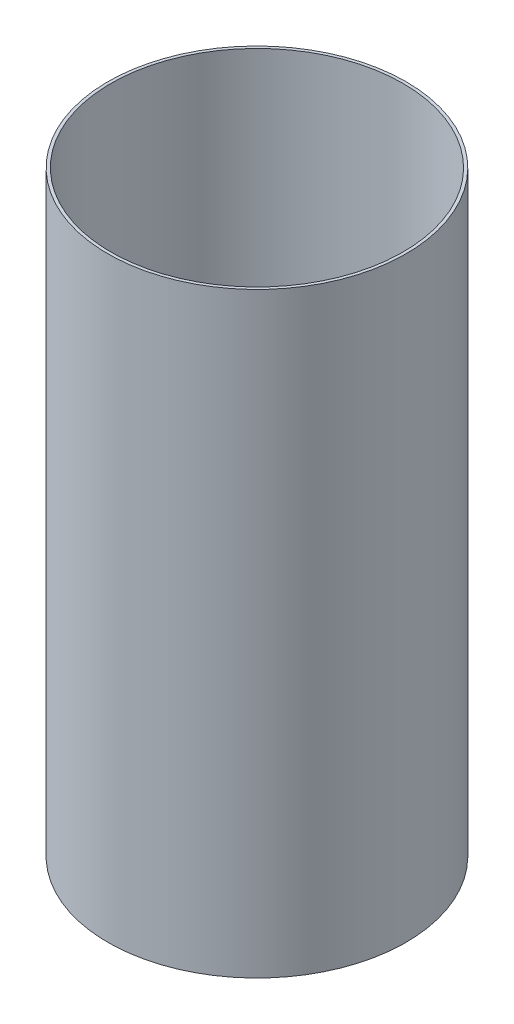
ISO-10303-21;
HEADER;
FILE_DESCRIPTION(('STEP AP214'),'2;1');
FILE_NAME('part.step','',(''),(''),'','','');
FILE_SCHEMA(('AUTOMOTIVE_DESIGN { 1 0 10303 214 1 1 1 1 }'));
ENDSEC;
DATA;
#1=APPLICATION_CONTEXT('core data for automotive mechanical design processes');
#2=APPLICATION_PROTOCOL_DEFINITION('international standard','automotive_design',2000,#1);
#3=PRODUCT_CONTEXT('',#1,'mechanical');
#4=PRODUCT('Part','Part','',(#3));
#5=PRODUCT_RELATED_PRODUCT_CATEGORY('part','',(#4));
#6=PRODUCT_DEFINITION_FORMATION('','',#4);
#7=PRODUCT_DEFINITION_CONTEXT('part definition',#1,'design');
#8=PRODUCT_DEFINITION('design','',#6,#7);
#9=PRODUCT_DEFINITION_SHAPE('','',#8);
#10=(LENGTH_UNIT() NAMED_UNIT(*) SI_UNIT(.MILLI.,.METRE.));
#11=(NAMED_UNIT(*) PLANE_ANGLE_UNIT() SI_UNIT($,.RADIAN.));
#12=(NAMED_UNIT(*) SI_UNIT($,.STERADIAN.) SOLID_ANGLE_UNIT());
#13=UNCERTAINTY_MEASURE_WITH_UNIT(LENGTH_MEASURE(1.E-05),#10,'distance_accuracy_value','');
#14=(GEOMETRIC_REPRESENTATION_CONTEXT(3) GLOBAL_UNCERTAINTY_ASSIGNED_CONTEXT((#13)) GLOBAL_UNIT_ASSIGNED_CONTEXT((#10,
#11,#12)) REPRESENTATION_CONTEXT('',''));
#15=CARTESIAN_POINT('',(0.,0.,0.));
#16=DIRECTION('',(0.,0.,1.));
#17=DIRECTION('',(1.,0.,0.));
#18=AXIS2_PLACEMENT_3D('',#15,#16,#17);
#19=CARTESIAN_POINT('',(0.,0.,0.));
#20=DIRECTION('',(0.,-1.,0.));
#21=DIRECTION('',(0.,0.,-1.));
#22=AXIS2_PLACEMENT_3D('',#19,#20,#21);
#23=CYLINDRICAL_SURFACE('',#22,50.);
#24=CARTESIAN_POINT('',(0.,200.,0.));
#25=DIRECTION('',(0.,-1.,0.));
#26=DIRECTION('',(0.,0.,-1.));
#27=AXIS2_PLACEMENT_3D('',#24,#25,#26);
#28=CIRCLE('',#27,50.);
#29=CARTESIAN_POINT('',(0.,200.,-50.));
#30=VERTEX_POINT('',#29);
#31=EDGE_CURVE('E45',#30,#30,#28,.T.);
#32=ORIENTED_EDGE('',*,*,#31,.T.);
#33=EDGE_LOOP('',(#32));
#34=FACE_BOUND('',#33,.T.);
#35=CARTESIAN_POINT('',(0.,0.,0.));
#36=DIRECTION('',(0.,-1.,0.));
#37=DIRECTION('',(0.,0.,-1.));
#38=AXIS2_PLACEMENT_3D('',#35,#36,#37);
#39=CIRCLE('',#38,50.);
#40=CARTESIAN_POINT('',(0.,0.,-50.));
#41=VERTEX_POINT('',#40);
#42=EDGE_CURVE('E10',#41,#41,#39,.T.);
#43=ORIENTED_EDGE('',*,*,#42,.F.);
#44=EDGE_LOOP('',(#43));
#45=FACE_BOUND('',#44,.T.);
#46=ADVANCED_FACE('F31',(#34,#45),#23,.T.);
#47=CARTESIAN_POINT('',(50.,0.,0.));
#48=DIRECTION('',(0.,1.,0.));
#49=DIRECTION('',(0.,0.,1.));
#50=AXIS2_PLACEMENT_3D('',#47,#48,#49);
#51=PLANE('',#50);
#52=CARTESIAN_POINT('',(0.,0.,0.));
#53=DIRECTION('',(0.,-1.,0.));
#54=DIRECTION('',(0.,0.,-1.));
#55=AXIS2_PLACEMENT_3D('',#52,#53,#54);
#56=CIRCLE('',#55,49.);
#57=CARTESIAN_POINT('',(0.,0.,-49.));
#58=VERTEX_POINT('',#57);
#59=EDGE_CURVE('E37',#58,#58,#56,.T.);
#60=ORIENTED_EDGE('',*,*,#59,.F.);
#61=EDGE_LOOP('',(#60));
#62=FACE_BOUND('',#61,.T.);
#63=ORIENTED_EDGE('',*,*,#42,.T.);
#64=EDGE_LOOP('',(#63));
#65=FACE_BOUND('',#64,.T.);
#66=ADVANCED_FACE('F61',(#62,#65),#51,.F.);
#67=CARTESIAN_POINT('',(0.,0.,0.));
#68=DIRECTION('',(0.,-1.,0.));
#69=DIRECTION('',(0.,0.,-1.));
#70=AXIS2_PLACEMENT_3D('',#67,#68,#69);
#71=CYLINDRICAL_SURFACE('',#70,49.);
#72=CARTESIAN_POINT('',(0.,200.,0.));
#73=DIRECTION('',(0.,-1.,0.));
#74=DIRECTION('',(0.,0.,-1.));
#75=AXIS2_PLACEMENT_3D('',#72,#73,#74);
#76=CIRCLE('',#75,49.);
#77=CARTESIAN_POINT('',(0.,200.,-49.));
#78=VERTEX_POINT('',#77);
#79=EDGE_CURVE('E41',#78,#78,#76,.T.);
#80=ORIENTED_EDGE('',*,*,#79,.F.);
#81=EDGE_LOOP('',(#80));
#82=FACE_BOUND('',#81,.T.);
#83=ORIENTED_EDGE('',*,*,#59,.T.);
#84=EDGE_LOOP('',(#83));
#85=FACE_BOUND('',#84,.T.);
#86=ADVANCED_FACE('F56',(#82,#85),#71,.F.);
#87=CARTESIAN_POINT('',(49.,200.,0.));
#88=DIRECTION('',(0.,-1.,0.));
#89=DIRECTION('',(0.,0.,-1.));
#90=AXIS2_PLACEMENT_3D('',#87,#88,#89);
#91=PLANE('',#90);
#92=ORIENTED_EDGE('',*,*,#31,.F.);
#93=EDGE_LOOP('',(#92));
#94=FACE_BOUND('',#93,.T.);
#95=ORIENTED_EDGE('',*,*,#79,.T.);
#96=EDGE_LOOP('',(#95));
#97=FACE_BOUND('',#96,.T.);
#98=ADVANCED_FACE('F53',(#94,#97),#91,.F.);
#99=CLOSED_SHELL('',(#46,#66,#86,#98));
#100=MANIFOLD_SOLID_BREP('B2',#99);
#101=ADVANCED_BREP_SHAPE_REPRESENTATION('',(#18,#100),#14);
#102=SHAPE_DEFINITION_REPRESENTATION(#9,#101);
ENDSEC;
END-ISO-10303-21;
